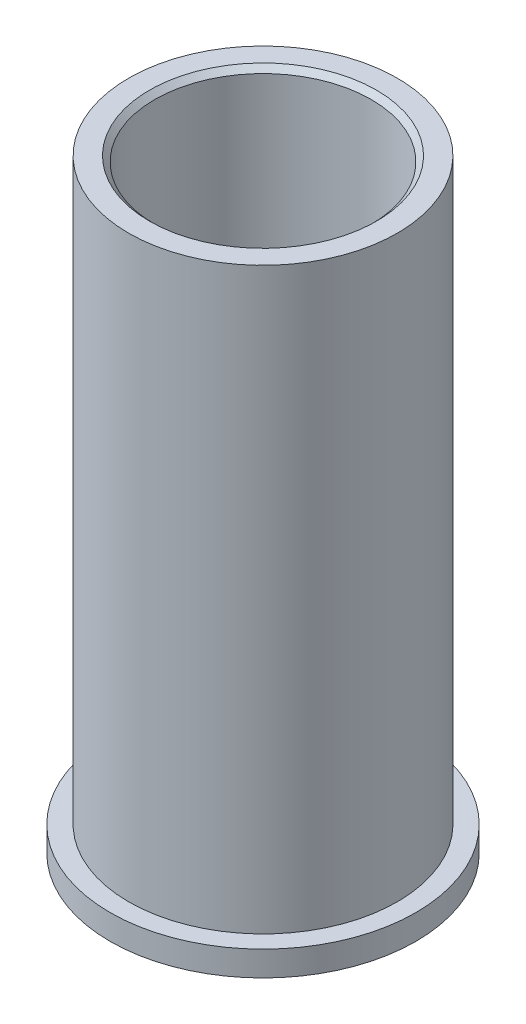
ISO-10303-21;
HEADER;
FILE_DESCRIPTION(('STEP AP214'),'2;1');
FILE_NAME('part.step','',(''),(''),'','','');
FILE_SCHEMA(('AUTOMOTIVE_DESIGN { 1 0 10303 214 1 1 1 1 }'));
ENDSEC;
DATA;
#1=APPLICATION_CONTEXT('core data for automotive mechanical design processes');
#2=APPLICATION_PROTOCOL_DEFINITION('international standard','automotive_design',2000,#1);
#3=PRODUCT_CONTEXT('',#1,'mechanical');
#4=PRODUCT('Part','Part','',(#3));
#5=PRODUCT_RELATED_PRODUCT_CATEGORY('part','',(#4));
#6=PRODUCT_DEFINITION_FORMATION('','',#4);
#7=PRODUCT_DEFINITION_CONTEXT('part definition',#1,'design');
#8=PRODUCT_DEFINITION('design','',#6,#7);
#9=PRODUCT_DEFINITION_SHAPE('','',#8);
#10=(LENGTH_UNIT() NAMED_UNIT(*) SI_UNIT(.MILLI.,.METRE.));
#11=(NAMED_UNIT(*) PLANE_ANGLE_UNIT() SI_UNIT($,.RADIAN.));
#12=(NAMED_UNIT(*) SI_UNIT($,.STERADIAN.) SOLID_ANGLE_UNIT());
#13=UNCERTAINTY_MEASURE_WITH_UNIT(LENGTH_MEASURE(1.E-05),#10,'distance_accuracy_value','');
#14=(GEOMETRIC_REPRESENTATION_CONTEXT(3) GLOBAL_UNCERTAINTY_ASSIGNED_CONTEXT((#13)) GLOBAL_UNIT_ASSIGNED_CONTEXT((#10,
#11,#12)) REPRESENTATION_CONTEXT('',''));
#15=CARTESIAN_POINT('',(0.,0.,0.));
#16=DIRECTION('',(0.,0.,1.));
#17=DIRECTION('',(1.,0.,0.));
#18=AXIS2_PLACEMENT_3D('',#15,#16,#17);
#19=CARTESIAN_POINT('',(0.,0.,0.));
#20=DIRECTION('',(0.,1.,0.));
#21=DIRECTION('',(0.,0.,1.));
#22=AXIS2_PLACEMENT_3D('',#19,#20,#21);
#23=CYLINDRICAL_SURFACE('',#22,14.4526);
#24=CARTESIAN_POINT('',(0.,0.,0.));
#25=DIRECTION('',(0.,1.,0.));
#26=DIRECTION('',(0.,0.,1.));
#27=AXIS2_PLACEMENT_3D('',#24,#25,#26);
#28=CIRCLE('',#27,14.4526);
#29=CARTESIAN_POINT('',(0.,0.,14.4526));
#30=VERTEX_POINT('',#29);
#31=EDGE_CURVE('E10',#30,#30,#28,.T.);
#32=ORIENTED_EDGE('',*,*,#31,.T.);
#33=EDGE_LOOP('',(#32));
#34=FACE_BOUND('',#33,.T.);
#35=CARTESIAN_POINT('',(0.,2.3622,0.));
#36=DIRECTION('',(0.,1.,0.));
#37=DIRECTION('',(0.,0.,1.));
#38=AXIS2_PLACEMENT_3D('',#35,#36,#37);
#39=CIRCLE('',#38,14.4526);
#40=CARTESIAN_POINT('',(0.,2.3622,14.4526));
#41=VERTEX_POINT('',#40);
#42=EDGE_CURVE('E59',#41,#41,#39,.T.);
#43=ORIENTED_EDGE('',*,*,#42,.F.);
#44=EDGE_LOOP('',(#43));
#45=FACE_BOUND('',#44,.T.);
#46=ADVANCED_FACE('F31',(#34,#45),#23,.T.);
#47=CARTESIAN_POINT('',(14.4526,0.,0.));
#48=DIRECTION('',(0.,-1.,0.));
#49=DIRECTION('',(0.,0.,-1.));
#50=AXIS2_PLACEMENT_3D('',#47,#48,#49);
#51=PLANE('',#50);
#52=CARTESIAN_POINT('',(0.,0.,0.));
#53=DIRECTION('',(0.,1.,0.));
#54=DIRECTION('',(0.,0.,1.));
#55=AXIS2_PLACEMENT_3D('',#52,#53,#54);
#56=CIRCLE('',#55,10.7315);
#57=CARTESIAN_POINT('',(0.,0.,10.7315));
#58=VERTEX_POINT('',#57);
#59=EDGE_CURVE('E37',#58,#58,#56,.T.);
#60=ORIENTED_EDGE('',*,*,#59,.T.);
#61=EDGE_LOOP('',(#60));
#62=FACE_BOUND('',#61,.T.);
#63=ORIENTED_EDGE('',*,*,#31,.F.);
#64=EDGE_LOOP('',(#63));
#65=FACE_BOUND('',#64,.T.);
#66=ADVANCED_FACE('F67',(#62,#65),#51,.T.);
#67=CARTESIAN_POINT('',(0.,0.,0.));
#68=DIRECTION('',(0.,-1.,0.));
#69=DIRECTION('',(0.,0.,-1.));
#70=AXIS2_PLACEMENT_3D('',#67,#68,#69);
#71=CONICAL_SURFACE('',#70,10.7315,0.785398163397449);
#72=CARTESIAN_POINT('',(0.,0.508000000000005,0.));
#73=DIRECTION('',(0.,1.,0.));
#74=DIRECTION('',(0.,0.,1.));
#75=AXIS2_PLACEMENT_3D('',#72,#73,#74);
#76=CIRCLE('',#75,10.2235);
#77=CARTESIAN_POINT('',(0.,0.508000000000005,10.2235));
#78=VERTEX_POINT('',#77);
#79=EDGE_CURVE('E41',#78,#78,#76,.T.);
#80=ORIENTED_EDGE('',*,*,#79,.T.);
#81=EDGE_LOOP('',(#80));
#82=FACE_BOUND('',#81,.T.);
#83=ORIENTED_EDGE('',*,*,#59,.F.);
#84=EDGE_LOOP('',(#83));
#85=FACE_BOUND('',#84,.T.);
#86=ADVANCED_FACE('F71',(#82,#85),#71,.F.);
#87=CARTESIAN_POINT('',(0.,0.,0.));
#88=DIRECTION('',(0.,1.,0.));
#89=DIRECTION('',(0.,0.,1.));
#90=AXIS2_PLACEMENT_3D('',#87,#88,#89);
#91=CYLINDRICAL_SURFACE('',#90,10.2235);
#92=CARTESIAN_POINT('',(0.,56.5912,0.));
#93=DIRECTION('',(0.,1.,0.));
#94=DIRECTION('',(0.,0.,1.));
#95=AXIS2_PLACEMENT_3D('',#92,#93,#94);
#96=CIRCLE('',#95,10.2235);
#97=CARTESIAN_POINT('',(0.,56.5912,10.2235));
#98=VERTEX_POINT('',#97);
#99=EDGE_CURVE('E45',#98,#98,#96,.T.);
#100=ORIENTED_EDGE('',*,*,#99,.T.);
#101=EDGE_LOOP('',(#100));
#102=FACE_BOUND('',#101,.T.);
#103=ORIENTED_EDGE('',*,*,#79,.F.);
#104=EDGE_LOOP('',(#103));
#105=FACE_BOUND('',#104,.T.);
#106=ADVANCED_FACE('F75',(#102,#105),#91,.F.);
#107=CARTESIAN_POINT('',(0.,56.5912,0.));
#108=DIRECTION('',(0.,1.,0.));
#109=DIRECTION('',(0.,0.,1.));
#110=AXIS2_PLACEMENT_3D('',#107,#108,#109);
#111=CONICAL_SURFACE('',#110,10.2235,0.785398163397455);
#112=CARTESIAN_POINT('',(0.,57.0992,0.));
#113=DIRECTION('',(0.,1.,0.));
#114=DIRECTION('',(0.,0.,1.));
#115=AXIS2_PLACEMENT_3D('',#112,#113,#114);
#116=CIRCLE('',#115,10.7315);
#117=CARTESIAN_POINT('',(0.,57.0992,10.7315));
#118=VERTEX_POINT('',#117);
#119=EDGE_CURVE('E50',#118,#118,#116,.T.);
#120=ORIENTED_EDGE('',*,*,#119,.T.);
#121=EDGE_LOOP('',(#120));
#122=FACE_BOUND('',#121,.T.);
#123=ORIENTED_EDGE('',*,*,#99,.F.);
#124=EDGE_LOOP('',(#123));
#125=FACE_BOUND('',#124,.T.);
#126=ADVANCED_FACE('F82',(#122,#125),#111,.F.);
#127=CARTESIAN_POINT('',(10.7315,57.0992,0.));
#128=DIRECTION('',(0.,1.,0.));
#129=DIRECTION('',(0.,0.,1.));
#130=AXIS2_PLACEMENT_3D('',#127,#128,#129);
#131=PLANE('',#130);
#132=CARTESIAN_POINT('',(0.,57.0992,0.));
#133=DIRECTION('',(0.,1.,0.));
#134=DIRECTION('',(0.,0.,1.));
#135=AXIS2_PLACEMENT_3D('',#132,#133,#134);
#136=CIRCLE('',#135,12.69619);
#137=CARTESIAN_POINT('',(0.,57.0992,12.69619));
#138=VERTEX_POINT('',#137);
#139=EDGE_CURVE('E53',#138,#138,#136,.T.);
#140=ORIENTED_EDGE('',*,*,#139,.T.);
#141=EDGE_LOOP('',(#140));
#142=FACE_BOUND('',#141,.T.);
#143=ORIENTED_EDGE('',*,*,#119,.F.);
#144=EDGE_LOOP('',(#143));
#145=FACE_BOUND('',#144,.T.);
#146=ADVANCED_FACE('F86',(#142,#145),#131,.T.);
#147=CARTESIAN_POINT('',(0.,0.,0.));
#148=DIRECTION('',(0.,1.,0.));
#149=DIRECTION('',(0.,0.,1.));
#150=AXIS2_PLACEMENT_3D('',#147,#148,#149);
#151=CYLINDRICAL_SURFACE('',#150,12.69619);
#152=CARTESIAN_POINT('',(0.,2.3622,0.));
#153=DIRECTION('',(0.,1.,0.));
#154=DIRECTION('',(0.,0.,1.));
#155=AXIS2_PLACEMENT_3D('',#152,#153,#154);
#156=CIRCLE('',#155,12.69619);
#157=CARTESIAN_POINT('',(0.,2.3622,12.69619));
#158=VERTEX_POINT('',#157);
#159=EDGE_CURVE('E56',#158,#158,#156,.T.);
#160=ORIENTED_EDGE('',*,*,#159,.T.);
#161=EDGE_LOOP('',(#160));
#162=FACE_BOUND('',#161,.T.);
#163=ORIENTED_EDGE('',*,*,#139,.F.);
#164=EDGE_LOOP('',(#163));
#165=FACE_BOUND('',#164,.T.);
#166=ADVANCED_FACE('F90',(#162,#165),#151,.T.);
#167=CARTESIAN_POINT('',(12.69619,2.3622,0.));
#168=DIRECTION('',(0.,1.,0.));
#169=DIRECTION('',(0.,0.,1.));
#170=AXIS2_PLACEMENT_3D('',#167,#168,#169);
#171=PLANE('',#170);
#172=ORIENTED_EDGE('',*,*,#42,.T.);
#173=EDGE_LOOP('',(#172));
#174=FACE_BOUND('',#173,.T.);
#175=ORIENTED_EDGE('',*,*,#159,.F.);
#176=EDGE_LOOP('',(#175));
#177=FACE_BOUND('',#176,.T.);
#178=ADVANCED_FACE('F63',(#174,#177),#171,.T.);
#179=CLOSED_SHELL('',(#46,#66,#86,#106,#126,#146,#166,#178));
#180=MANIFOLD_SOLID_BREP('B2',#179);
#181=ADVANCED_BREP_SHAPE_REPRESENTATION('',(#18,#180),#14);
#182=SHAPE_DEFINITION_REPRESENTATION(#9,#181);
ENDSEC;
END-ISO-10303-21;
